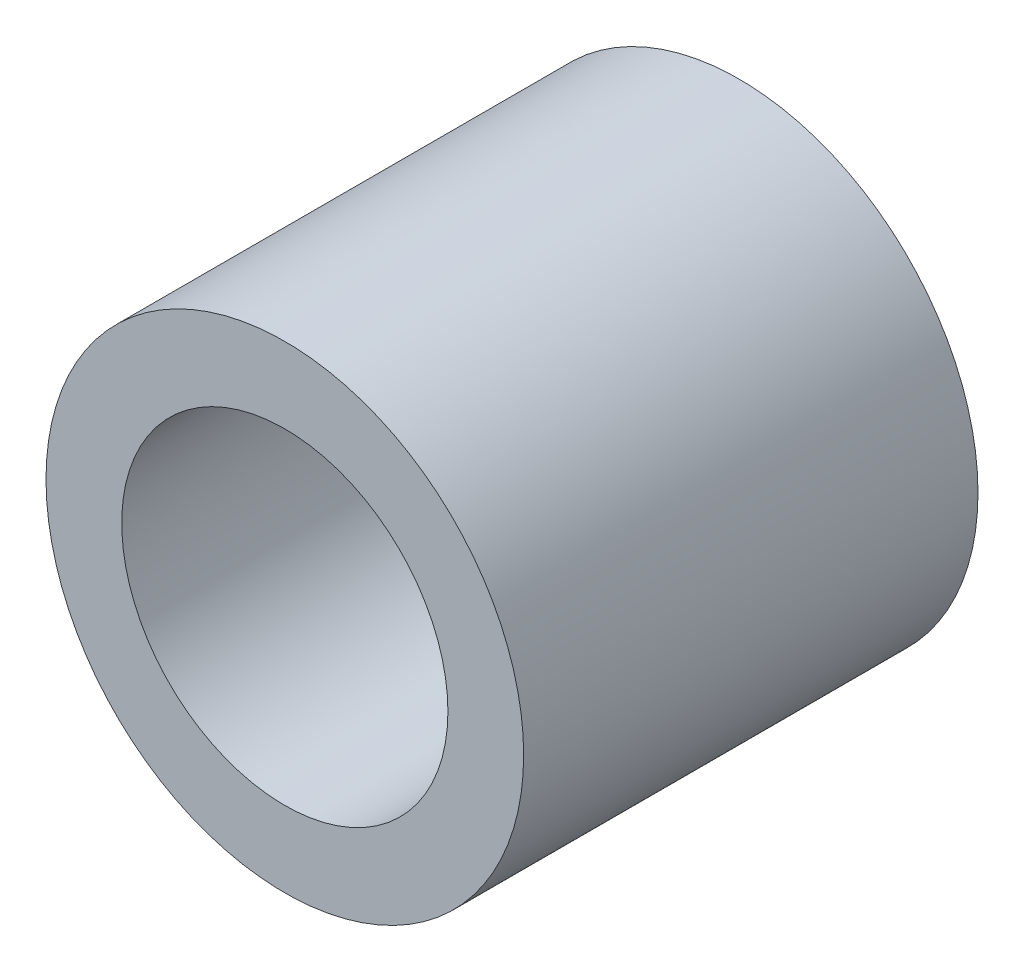
ISO-10303-21;
HEADER;
FILE_DESCRIPTION(('STEP AP214'),'2;1');
FILE_NAME('part.step','',(''),(''),'','','');
FILE_SCHEMA(('AUTOMOTIVE_DESIGN { 1 0 10303 214 1 1 1 1 }'));
ENDSEC;
DATA;
#1=APPLICATION_CONTEXT('core data for automotive mechanical design processes');
#2=APPLICATION_PROTOCOL_DEFINITION('international standard','automotive_design',2000,#1);
#3=PRODUCT_CONTEXT('',#1,'mechanical');
#4=PRODUCT('Part','Part','',(#3));
#5=PRODUCT_RELATED_PRODUCT_CATEGORY('part','',(#4));
#6=PRODUCT_DEFINITION_FORMATION('','',#4);
#7=PRODUCT_DEFINITION_CONTEXT('part definition',#1,'design');
#8=PRODUCT_DEFINITION('design','',#6,#7);
#9=PRODUCT_DEFINITION_SHAPE('','',#8);
#10=(LENGTH_UNIT() NAMED_UNIT(*) SI_UNIT(.MILLI.,.METRE.));
#11=(NAMED_UNIT(*) PLANE_ANGLE_UNIT() SI_UNIT($,.RADIAN.));
#12=(NAMED_UNIT(*) SI_UNIT($,.STERADIAN.) SOLID_ANGLE_UNIT());
#13=UNCERTAINTY_MEASURE_WITH_UNIT(LENGTH_MEASURE(1.E-05),#10,'distance_accuracy_value','');
#14=(GEOMETRIC_REPRESENTATION_CONTEXT(3) GLOBAL_UNCERTAINTY_ASSIGNED_CONTEXT((#13)) GLOBAL_UNIT_ASSIGNED_CONTEXT((#10,
#11,#12)) REPRESENTATION_CONTEXT('',''));
#15=CARTESIAN_POINT('',(0.,0.,0.));
#16=DIRECTION('',(0.,0.,1.));
#17=DIRECTION('',(1.,0.,0.));
#18=AXIS2_PLACEMENT_3D('',#15,#16,#17);
#19=CARTESIAN_POINT('',(0.,0.,3.9));
#20=DIRECTION('',(0.,0.,1.));
#21=DIRECTION('',(1.,0.,0.));
#22=AXIS2_PLACEMENT_3D('',#19,#20,#21);
#23=PLANE('',#22);
#24=CARTESIAN_POINT('',(0.,0.,3.9));
#25=DIRECTION('',(0.,0.,1.));
#26=DIRECTION('',(1.,0.,0.));
#27=AXIS2_PLACEMENT_3D('',#24,#25,#26);
#28=CIRCLE('',#27,2.05);
#29=CARTESIAN_POINT('',(2.05,0.,3.9));
#30=VERTEX_POINT('',#29);
#31=EDGE_CURVE('E10',#30,#30,#28,.T.);
#32=ORIENTED_EDGE('',*,*,#31,.T.);
#33=EDGE_LOOP('',(#32));
#34=FACE_BOUND('',#33,.T.);
#35=CARTESIAN_POINT('',(0.,0.,3.9));
#36=DIRECTION('',(0.,0.,1.));
#37=DIRECTION('',(1.,0.,0.));
#38=AXIS2_PLACEMENT_3D('',#35,#36,#37);
#39=CIRCLE('',#38,1.4);
#40=CARTESIAN_POINT('',(1.4,0.,3.9));
#41=VERTEX_POINT('',#40);
#42=EDGE_CURVE('E55',#41,#41,#39,.T.);
#43=ORIENTED_EDGE('',*,*,#42,.F.);
#44=EDGE_LOOP('',(#43));
#45=FACE_BOUND('',#44,.T.);
#46=ADVANCED_FACE('F42',(#34,#45),#23,.T.);
#47=CARTESIAN_POINT('',(0.,0.,0.));
#48=DIRECTION('',(0.,0.,1.));
#49=DIRECTION('',(1.,0.,0.));
#50=AXIS2_PLACEMENT_3D('',#47,#48,#49);
#51=PLANE('',#50);
#52=CARTESIAN_POINT('',(0.,0.,0.));
#53=DIRECTION('',(0.,0.,1.));
#54=DIRECTION('',(1.,0.,0.));
#55=AXIS2_PLACEMENT_3D('',#52,#53,#54);
#56=CIRCLE('',#55,2.05);
#57=CARTESIAN_POINT('',(2.05,0.,0.));
#58=VERTEX_POINT('',#57);
#59=EDGE_CURVE('E46',#58,#58,#56,.T.);
#60=ORIENTED_EDGE('',*,*,#59,.F.);
#61=EDGE_LOOP('',(#60));
#62=FACE_BOUND('',#61,.T.);
#63=CARTESIAN_POINT('',(0.,0.,0.));
#64=DIRECTION('',(0.,0.,1.));
#65=DIRECTION('',(1.,0.,0.));
#66=AXIS2_PLACEMENT_3D('',#63,#64,#65);
#67=CIRCLE('',#66,1.4);
#68=CARTESIAN_POINT('',(1.4,0.,0.));
#69=VERTEX_POINT('',#68);
#70=EDGE_CURVE('E57',#69,#69,#67,.T.);
#71=ORIENTED_EDGE('',*,*,#70,.T.);
#72=EDGE_LOOP('',(#71));
#73=FACE_BOUND('',#72,.T.);
#74=ADVANCED_FACE('F69',(#62,#73),#51,.F.);
#75=CARTESIAN_POINT('',(0.,0.,3.9));
#76=DIRECTION('',(0.,0.,-1.));
#77=DIRECTION('',(-1.,0.,0.));
#78=AXIS2_PLACEMENT_3D('',#75,#76,#77);
#79=CYLINDRICAL_SURFACE('',#78,2.05);
#80=ORIENTED_EDGE('',*,*,#31,.F.);
#81=EDGE_LOOP('',(#80));
#82=FACE_BOUND('',#81,.T.);
#83=ORIENTED_EDGE('',*,*,#59,.T.);
#84=EDGE_LOOP('',(#83));
#85=FACE_BOUND('',#84,.T.);
#86=ADVANCED_FACE('F44',(#82,#85),#79,.T.);
#87=CARTESIAN_POINT('',(0.,0.,3.9));
#88=DIRECTION('',(0.,0.,-1.));
#89=DIRECTION('',(-1.,0.,0.));
#90=AXIS2_PLACEMENT_3D('',#87,#88,#89);
#91=CYLINDRICAL_SURFACE('',#90,1.4);
#92=ORIENTED_EDGE('',*,*,#42,.T.);
#93=EDGE_LOOP('',(#92));
#94=FACE_BOUND('',#93,.T.);
#95=ORIENTED_EDGE('',*,*,#70,.F.);
#96=EDGE_LOOP('',(#95));
#97=FACE_BOUND('',#96,.T.);
#98=ADVANCED_FACE('F65',(#94,#97),#91,.F.);
#99=CLOSED_SHELL('',(#46,#74,#86,#98));
#100=MANIFOLD_SOLID_BREP('B2',#99);
#101=ADVANCED_BREP_SHAPE_REPRESENTATION('',(#18,#100),#14);
#102=SHAPE_DEFINITION_REPRESENTATION(#9,#101);
ENDSEC;
END-ISO-10303-21;
